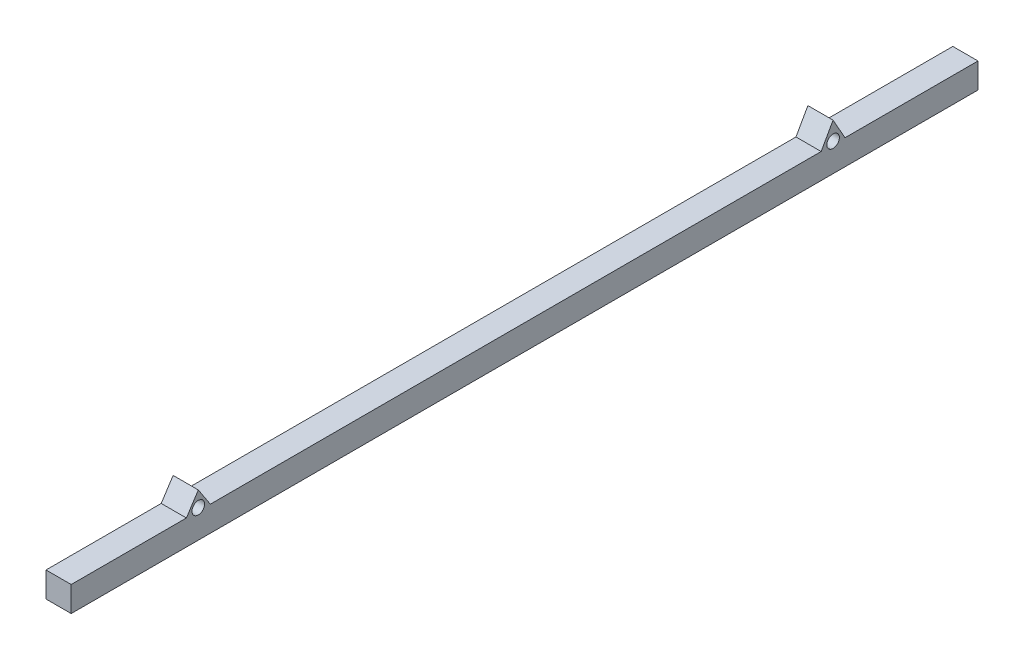
ISO-10303-21;
HEADER;
FILE_DESCRIPTION(('STEP AP214'),'2;1');
FILE_NAME('part.step','',(''),(''),'','','');
FILE_SCHEMA(('AUTOMOTIVE_DESIGN { 1 0 10303 214 1 1 1 1 }'));
ENDSEC;
DATA;
#1=APPLICATION_CONTEXT('core data for automotive mechanical design processes');
#2=APPLICATION_PROTOCOL_DEFINITION('international standard','automotive_design',2000,#1);
#3=PRODUCT_CONTEXT('',#1,'mechanical');
#4=PRODUCT('Part','Part','',(#3));
#5=PRODUCT_RELATED_PRODUCT_CATEGORY('part','',(#4));
#6=PRODUCT_DEFINITION_FORMATION('','',#4);
#7=PRODUCT_DEFINITION_CONTEXT('part definition',#1,'design');
#8=PRODUCT_DEFINITION('design','',#6,#7);
#9=PRODUCT_DEFINITION_SHAPE('','',#8);
#10=(LENGTH_UNIT() NAMED_UNIT(*) SI_UNIT(.MILLI.,.METRE.));
#11=(NAMED_UNIT(*) PLANE_ANGLE_UNIT() SI_UNIT($,.RADIAN.));
#12=(NAMED_UNIT(*) SI_UNIT($,.STERADIAN.) SOLID_ANGLE_UNIT());
#13=UNCERTAINTY_MEASURE_WITH_UNIT(LENGTH_MEASURE(1.E-05),#10,'distance_accuracy_value','');
#14=(GEOMETRIC_REPRESENTATION_CONTEXT(3) GLOBAL_UNCERTAINTY_ASSIGNED_CONTEXT((#13)) GLOBAL_UNIT_ASSIGNED_CONTEXT((#10,
#11,#12)) REPRESENTATION_CONTEXT('',''));
#15=CARTESIAN_POINT('',(0.,0.,0.));
#16=DIRECTION('',(0.,0.,1.));
#17=DIRECTION('',(1.,0.,0.));
#18=AXIS2_PLACEMENT_3D('',#15,#16,#17);
#19=CARTESIAN_POINT('',(-5.,0.,0.));
#20=DIRECTION('',(0.,0.,1.));
#21=DIRECTION('',(1.,0.,0.));
#22=AXIS2_PLACEMENT_3D('',#19,#20,#21);
#23=PLANE('',#22);
#24=DIRECTION('',(0.,-1.,0.));
#25=VECTOR('',#24,1.);
#26=CARTESIAN_POINT('',(0.,0.,0.));
#27=LINE('',#26,#25);
#28=CARTESIAN_POINT('',(0.,5.,0.));
#29=VERTEX_POINT('',#28);
#30=CARTESIAN_POINT('',(0.,0.,0.));
#31=VERTEX_POINT('',#30);
#32=EDGE_CURVE('E146',#29,#31,#27,.T.);
#33=ORIENTED_EDGE('',*,*,#32,.F.);
#34=DIRECTION('',(1.,0.,0.));
#35=VECTOR('',#34,1.);
#36=CARTESIAN_POINT('',(-5.,5.,0.));
#37=LINE('',#36,#35);
#38=CARTESIAN_POINT('',(-5.,5.,0.));
#39=VERTEX_POINT('',#38);
#40=EDGE_CURVE('E11',#39,#29,#37,.T.);
#41=ORIENTED_EDGE('',*,*,#40,.F.);
#42=DIRECTION('',(0.,-1.,0.));
#43=VECTOR('',#42,1.);
#44=CARTESIAN_POINT('',(-5.,0.,0.));
#45=LINE('',#44,#43);
#46=CARTESIAN_POINT('',(-5.,0.,0.));
#47=VERTEX_POINT('',#46);
#48=EDGE_CURVE('E173',#39,#47,#45,.T.);
#49=ORIENTED_EDGE('',*,*,#48,.T.);
#50=DIRECTION('',(1.,0.,0.));
#51=VECTOR('',#50,1.);
#52=CARTESIAN_POINT('',(-5.,0.,0.));
#53=LINE('',#52,#51);
#54=EDGE_CURVE('E40',#47,#31,#53,.T.);
#55=ORIENTED_EDGE('',*,*,#54,.T.);
#56=EDGE_LOOP('',(#33,#41,#49,#55));
#57=FACE_BOUND('',#56,.T.);
#58=ADVANCED_FACE('F37',(#57),#23,.T.);
#59=CARTESIAN_POINT('',(-5.,5.,0.));
#60=DIRECTION('',(0.,1.,0.));
#61=DIRECTION('',(0.,0.,1.));
#62=AXIS2_PLACEMENT_3D('',#59,#60,#61);
#63=PLANE('',#62);
#64=DIRECTION('',(0.,0.,1.));
#65=VECTOR('',#64,1.);
#66=CARTESIAN_POINT('',(0.,5.,0.));
#67=LINE('',#66,#65);
#68=CARTESIAN_POINT('',(0.,5.,-22.8698931809179));
#69=VERTEX_POINT('',#68);
#70=EDGE_CURVE('E171',#69,#29,#67,.T.);
#71=ORIENTED_EDGE('',*,*,#70,.F.);
#72=DIRECTION('',(1.,0.,0.));
#73=VECTOR('',#72,1.);
#74=CARTESIAN_POINT('',(-5.,5.,-22.8698931809179));
#75=LINE('',#74,#73);
#76=CARTESIAN_POINT('',(-5.,5.,-22.8698931809179));
#77=VERTEX_POINT('',#76);
#78=EDGE_CURVE('E46',#77,#69,#75,.T.);
#79=ORIENTED_EDGE('',*,*,#78,.F.);
#80=DIRECTION('',(0.,0.,1.));
#81=VECTOR('',#80,1.);
#82=CARTESIAN_POINT('',(-5.,5.,0.));
#83=LINE('',#82,#81);
#84=EDGE_CURVE('E136',#77,#39,#83,.T.);
#85=ORIENTED_EDGE('',*,*,#84,.T.);
#86=ORIENTED_EDGE('',*,*,#40,.T.);
#87=EDGE_LOOP('',(#71,#79,#85,#86));
#88=FACE_BOUND('',#87,.T.);
#89=ADVANCED_FACE('F189',(#88),#63,.T.);
#90=CARTESIAN_POINT('',(-5.,8.63853703199878,-25.233));
#91=DIRECTION('',(0.,0.544673605340835,0.838648116700334));
#92=DIRECTION('',(0.,-0.838648116700334,0.544673605340835));
#93=AXIS2_PLACEMENT_3D('',#90,#91,#92);
#94=PLANE('',#93);
#95=DIRECTION('',(0.,-0.838648116700334,0.544673605340835));
#96=VECTOR('',#95,1.);
#97=CARTESIAN_POINT('',(0.,8.63853703199878,-25.233));
#98=LINE('',#97,#96);
#99=CARTESIAN_POINT('',(0.,8.63853703199878,-25.233));
#100=VERTEX_POINT('',#99);
#101=EDGE_CURVE('E123',#100,#69,#98,.T.);
#102=ORIENTED_EDGE('',*,*,#101,.F.);
#103=DIRECTION('',(1.,0.,0.));
#104=VECTOR('',#103,1.);
#105=CARTESIAN_POINT('',(-5.,8.63853703199878,-25.233));
#106=LINE('',#105,#104);
#107=CARTESIAN_POINT('',(-5.,8.63853703199878,-25.233));
#108=VERTEX_POINT('',#107);
#109=EDGE_CURVE('E118',#108,#100,#106,.T.);
#110=ORIENTED_EDGE('',*,*,#109,.F.);
#111=DIRECTION('',(0.,-0.838648116700334,0.544673605340835));
#112=VECTOR('',#111,1.);
#113=CARTESIAN_POINT('',(-5.,8.63853703199878,-25.233));
#114=LINE('',#113,#112);
#115=EDGE_CURVE('E121',#108,#77,#114,.T.);
#116=ORIENTED_EDGE('',*,*,#115,.T.);
#117=ORIENTED_EDGE('',*,*,#78,.T.);
#118=EDGE_LOOP('',(#102,#110,#116,#117));
#119=FACE_BOUND('',#118,.T.);
#120=ADVANCED_FACE('F120',(#119),#94,.T.);
#121=CARTESIAN_POINT('',(-5.,8.63853703199878,-25.233));
#122=DIRECTION('',(0.,0.548887878729885,-0.835895984308698));
#123=DIRECTION('',(0.,0.835895984308698,0.548887878729885));
#124=AXIS2_PLACEMENT_3D('',#121,#122,#123);
#125=PLANE('',#124);
#126=DIRECTION('',(0.,0.835895984308698,0.548887878729885));
#127=VECTOR('',#126,1.);
#128=CARTESIAN_POINT('',(0.,8.63853703199878,-25.233));
#129=LINE('',#128,#127);
#130=CARTESIAN_POINT('',(0.,5.,-27.6222313286152));
#131=VERTEX_POINT('',#130);
#132=EDGE_CURVE('E168',#131,#100,#129,.T.);
#133=ORIENTED_EDGE('',*,*,#132,.F.);
#134=DIRECTION('',(1.,0.,0.));
#135=VECTOR('',#134,1.);
#136=CARTESIAN_POINT('',(-5.,5.,-27.6222313286152));
#137=LINE('',#136,#135);
#138=CARTESIAN_POINT('',(-5.,5.,-27.6222313286152));
#139=VERTEX_POINT('',#138);
#140=EDGE_CURVE('E128',#139,#131,#137,.T.);
#141=ORIENTED_EDGE('',*,*,#140,.F.);
#142=DIRECTION('',(0.,0.835895984308698,0.548887878729885));
#143=VECTOR('',#142,1.);
#144=CARTESIAN_POINT('',(-5.,8.63853703199878,-25.233));
#145=LINE('',#144,#143);
#146=EDGE_CURVE('E134',#139,#108,#145,.T.);
#147=ORIENTED_EDGE('',*,*,#146,.T.);
#148=ORIENTED_EDGE('',*,*,#109,.T.);
#149=EDGE_LOOP('',(#133,#141,#147,#148));
#150=FACE_BOUND('',#149,.T.);
#151=ADVANCED_FACE('F138',(#150),#125,.T.);
#152=CARTESIAN_POINT('',(-5.,5.,-27.6222313286152));
#153=DIRECTION('',(0.,1.,0.));
#154=DIRECTION('',(0.,0.,1.));
#155=AXIS2_PLACEMENT_3D('',#152,#153,#154);
#156=PLANE('',#155);
#157=DIRECTION('',(0.,0.,1.));
#158=VECTOR('',#157,1.);
#159=CARTESIAN_POINT('',(0.,5.,-27.6222313286152));
#160=LINE('',#159,#158);
#161=CARTESIAN_POINT('',(0.,5.,-148.86647138583));
#162=VERTEX_POINT('',#161);
#163=EDGE_CURVE('E165',#162,#131,#160,.T.);
#164=ORIENTED_EDGE('',*,*,#163,.F.);
#165=DIRECTION('',(1.,0.,0.));
#166=VECTOR('',#165,1.);
#167=CARTESIAN_POINT('',(-5.,5.,-148.86647138583));
#168=LINE('',#167,#166);
#169=CARTESIAN_POINT('',(-5.,5.,-148.86647138583));
#170=VERTEX_POINT('',#169);
#171=EDGE_CURVE('E177',#170,#162,#168,.T.);
#172=ORIENTED_EDGE('',*,*,#171,.F.);
#173=DIRECTION('',(0.,0.,1.));
#174=VECTOR('',#173,1.);
#175=CARTESIAN_POINT('',(-5.,5.,-27.6222313286152));
#176=LINE('',#175,#174);
#177=EDGE_CURVE('E139',#170,#139,#176,.T.);
#178=ORIENTED_EDGE('',*,*,#177,.T.);
#179=ORIENTED_EDGE('',*,*,#140,.T.);
#180=EDGE_LOOP('',(#164,#172,#178,#179));
#181=FACE_BOUND('',#180,.T.);
#182=ADVANCED_FACE('F202',(#181),#156,.T.);
#183=CARTESIAN_POINT('',(-5.,9.21189857005811,-151.233));
#184=DIRECTION('',(0.,0.489842251703755,0.871811085296462));
#185=DIRECTION('',(0.,-0.871811085296462,0.489842251703755));
#186=AXIS2_PLACEMENT_3D('',#183,#184,#185);
#187=PLANE('',#186);
#188=DIRECTION('',(0.,-0.871811085296462,0.489842251703755));
#189=VECTOR('',#188,1.);
#190=CARTESIAN_POINT('',(0.,9.21189857005811,-151.233));
#191=LINE('',#190,#189);
#192=CARTESIAN_POINT('',(0.,9.21189857005811,-151.233));
#193=VERTEX_POINT('',#192);
#194=EDGE_CURVE('E162',#193,#162,#191,.T.);
#195=ORIENTED_EDGE('',*,*,#194,.F.);
#196=DIRECTION('',(1.,0.,0.));
#197=VECTOR('',#196,1.);
#198=CARTESIAN_POINT('',(-5.,9.21189857005811,-151.233));
#199=LINE('',#198,#197);
#200=CARTESIAN_POINT('',(-5.,9.21189857005811,-151.233));
#201=VERTEX_POINT('',#200);
#202=EDGE_CURVE('E179',#201,#193,#199,.T.);
#203=ORIENTED_EDGE('',*,*,#202,.F.);
#204=DIRECTION('',(0.,-0.871811085296462,0.489842251703755));
#205=VECTOR('',#204,1.);
#206=CARTESIAN_POINT('',(-5.,9.21189857005811,-151.233));
#207=LINE('',#206,#205);
#208=EDGE_CURVE('E141',#201,#170,#207,.T.);
#209=ORIENTED_EDGE('',*,*,#208,.T.);
#210=ORIENTED_EDGE('',*,*,#171,.T.);
#211=EDGE_LOOP('',(#195,#203,#209,#210));
#212=FACE_BOUND('',#211,.T.);
#213=ADVANCED_FACE('F205',(#212),#187,.T.);
#214=CARTESIAN_POINT('',(-5.,9.21189857005811,-151.233));
#215=DIRECTION('',(0.,0.489448415745772,-0.872032251882896));
#216=DIRECTION('',(0.,0.872032251882896,0.489448415745772));
#217=AXIS2_PLACEMENT_3D('',#214,#215,#216);
#218=PLANE('',#217);
#219=DIRECTION('',(0.,0.872032251882896,0.489448415745772));
#220=VECTOR('',#219,1.);
#221=CARTESIAN_POINT('',(0.,9.21189857005811,-151.233));
#222=LINE('',#221,#220);
#223=CARTESIAN_POINT('',(0.,5.,-153.597026190483));
#224=VERTEX_POINT('',#223);
#225=EDGE_CURVE('E159',#224,#193,#222,.T.);
#226=ORIENTED_EDGE('',*,*,#225,.F.);
#227=DIRECTION('',(1.,0.,0.));
#228=VECTOR('',#227,1.);
#229=CARTESIAN_POINT('',(-5.,5.,-153.597026190483));
#230=LINE('',#229,#228);
#231=CARTESIAN_POINT('',(-5.,5.,-153.597026190483));
#232=VERTEX_POINT('',#231);
#233=EDGE_CURVE('E181',#232,#224,#230,.T.);
#234=ORIENTED_EDGE('',*,*,#233,.F.);
#235=DIRECTION('',(0.,0.872032251882896,0.489448415745772));
#236=VECTOR('',#235,1.);
#237=CARTESIAN_POINT('',(-5.,9.21189857005811,-151.233));
#238=LINE('',#237,#236);
#239=EDGE_CURVE('E265',#232,#201,#238,.T.);
#240=ORIENTED_EDGE('',*,*,#239,.T.);
#241=ORIENTED_EDGE('',*,*,#202,.T.);
#242=EDGE_LOOP('',(#226,#234,#240,#241));
#243=FACE_BOUND('',#242,.T.);
#244=ADVANCED_FACE('F209',(#243),#218,.T.);
#245=CARTESIAN_POINT('',(-5.,5.,-153.597026190483));
#246=DIRECTION('',(0.,1.,0.));
#247=DIRECTION('',(0.,0.,1.));
#248=AXIS2_PLACEMENT_3D('',#245,#246,#247);
#249=PLANE('',#248);
#250=DIRECTION('',(0.,0.,1.));
#251=VECTOR('',#250,1.);
#252=CARTESIAN_POINT('',(0.,5.,-153.597026190483));
#253=LINE('',#252,#251);
#254=CARTESIAN_POINT('',(0.,5.,-180.));
#255=VERTEX_POINT('',#254);
#256=EDGE_CURVE('E156',#255,#224,#253,.T.);
#257=ORIENTED_EDGE('',*,*,#256,.F.);
#258=DIRECTION('',(1.,0.,0.));
#259=VECTOR('',#258,1.);
#260=CARTESIAN_POINT('',(-5.,5.,-180.));
#261=LINE('',#260,#259);
#262=CARTESIAN_POINT('',(-5.,5.,-180.));
#263=VERTEX_POINT('',#262);
#264=EDGE_CURVE('E183',#263,#255,#261,.T.);
#265=ORIENTED_EDGE('',*,*,#264,.F.);
#266=DIRECTION('',(0.,0.,1.));
#267=VECTOR('',#266,1.);
#268=CARTESIAN_POINT('',(-5.,5.,-153.597026190483));
#269=LINE('',#268,#267);
#270=EDGE_CURVE('E262',#263,#232,#269,.T.);
#271=ORIENTED_EDGE('',*,*,#270,.T.);
#272=ORIENTED_EDGE('',*,*,#233,.T.);
#273=EDGE_LOOP('',(#257,#265,#271,#272));
#274=FACE_BOUND('',#273,.T.);
#275=ADVANCED_FACE('F213',(#274),#249,.T.);
#276=CARTESIAN_POINT('',(-5.,0.,-180.));
#277=DIRECTION('',(0.,0.,-1.));
#278=DIRECTION('',(-1.,0.,0.));
#279=AXIS2_PLACEMENT_3D('',#276,#277,#278);
#280=PLANE('',#279);
#281=DIRECTION('',(0.,1.,0.));
#282=VECTOR('',#281,1.);
#283=CARTESIAN_POINT('',(0.,0.,-180.));
#284=LINE('',#283,#282);
#285=CARTESIAN_POINT('',(0.,0.,-180.));
#286=VERTEX_POINT('',#285);
#287=EDGE_CURVE('E153',#286,#255,#284,.T.);
#288=ORIENTED_EDGE('',*,*,#287,.F.);
#289=DIRECTION('',(1.,0.,0.));
#290=VECTOR('',#289,1.);
#291=CARTESIAN_POINT('',(-5.,0.,-180.));
#292=LINE('',#291,#290);
#293=CARTESIAN_POINT('',(-5.,0.,-180.));
#294=VERTEX_POINT('',#293);
#295=EDGE_CURVE('E184',#294,#286,#292,.T.);
#296=ORIENTED_EDGE('',*,*,#295,.F.);
#297=DIRECTION('',(0.,1.,0.));
#298=VECTOR('',#297,1.);
#299=CARTESIAN_POINT('',(-5.,0.,-180.));
#300=LINE('',#299,#298);
#301=EDGE_CURVE('E259',#294,#263,#300,.T.);
#302=ORIENTED_EDGE('',*,*,#301,.T.);
#303=ORIENTED_EDGE('',*,*,#264,.T.);
#304=EDGE_LOOP('',(#288,#296,#302,#303));
#305=FACE_BOUND('',#304,.T.);
#306=ADVANCED_FACE('F217',(#305),#280,.T.);
#307=CARTESIAN_POINT('',(-5.,0.,0.));
#308=DIRECTION('',(0.,-1.,0.));
#309=DIRECTION('',(0.,0.,-1.));
#310=AXIS2_PLACEMENT_3D('',#307,#308,#309);
#311=PLANE('',#310);
#312=DIRECTION('',(0.,0.,-1.));
#313=VECTOR('',#312,1.);
#314=CARTESIAN_POINT('',(0.,0.,0.));
#315=LINE('',#314,#313);
#316=EDGE_CURVE('E149',#31,#286,#315,.T.);
#317=ORIENTED_EDGE('',*,*,#316,.F.);
#318=ORIENTED_EDGE('',*,*,#54,.F.);
#319=DIRECTION('',(0.,0.,-1.));
#320=VECTOR('',#319,1.);
#321=CARTESIAN_POINT('',(-5.,0.,0.));
#322=LINE('',#321,#320);
#323=EDGE_CURVE('E257',#47,#294,#322,.T.);
#324=ORIENTED_EDGE('',*,*,#323,.T.);
#325=ORIENTED_EDGE('',*,*,#295,.T.);
#326=EDGE_LOOP('',(#317,#318,#324,#325));
#327=FACE_BOUND('',#326,.T.);
#328=ADVANCED_FACE('F186',(#327),#311,.T.);
#329=CARTESIAN_POINT('',(-5.,0.,0.));
#330=DIRECTION('',(-1.,0.,0.));
#331=DIRECTION('',(0.,0.,1.));
#332=AXIS2_PLACEMENT_3D('',#329,#330,#331);
#333=PLANE('',#332);
#334=CARTESIAN_POINT('',(-5.,5.59375626384249,-151.233));
#335=DIRECTION('',(1.,0.,0.));
#336=DIRECTION('',(0.,0.,-1.));
#337=AXIS2_PLACEMENT_3D('',#334,#335,#336);
#338=CIRCLE('',#337,1.25000000000001);
#339=CARTESIAN_POINT('',(-5.,5.59375626384249,-152.483));
#340=VERTEX_POINT('',#339);
#341=EDGE_CURVE('E244',#340,#340,#338,.T.);
#342=ORIENTED_EDGE('',*,*,#341,.T.);
#343=EDGE_LOOP('',(#342));
#344=FACE_BOUND('',#343,.T.);
#345=CARTESIAN_POINT('',(-5.,5.59375626384249,-25.233));
#346=DIRECTION('',(1.,0.,0.));
#347=DIRECTION('',(0.,0.,-1.));
#348=AXIS2_PLACEMENT_3D('',#345,#346,#347);
#349=CIRCLE('',#348,1.25);
#350=CARTESIAN_POINT('',(-5.,5.59375626384249,-26.483));
#351=VERTEX_POINT('',#350);
#352=EDGE_CURVE('E150',#351,#351,#349,.T.);
#353=ORIENTED_EDGE('',*,*,#352,.T.);
#354=EDGE_LOOP('',(#353));
#355=FACE_BOUND('',#354,.T.);
#356=ORIENTED_EDGE('',*,*,#48,.F.);
#357=ORIENTED_EDGE('',*,*,#84,.F.);
#358=ORIENTED_EDGE('',*,*,#115,.F.);
#359=ORIENTED_EDGE('',*,*,#146,.F.);
#360=ORIENTED_EDGE('',*,*,#177,.F.);
#361=ORIENTED_EDGE('',*,*,#208,.F.);
#362=ORIENTED_EDGE('',*,*,#239,.F.);
#363=ORIENTED_EDGE('',*,*,#270,.F.);
#364=ORIENTED_EDGE('',*,*,#301,.F.);
#365=ORIENTED_EDGE('',*,*,#323,.F.);
#366=EDGE_LOOP('',(#356,#357,#358,#359,#360,#361,#362,#363,#364,#365));
#367=FACE_BOUND('',#366,.T.);
#368=ADVANCED_FACE('F132',(#344,#355,#367),#333,.T.);
#369=CARTESIAN_POINT('',(0.,0.,0.));
#370=DIRECTION('',(-1.,0.,0.));
#371=DIRECTION('',(0.,0.,1.));
#372=AXIS2_PLACEMENT_3D('',#369,#370,#371);
#373=PLANE('',#372);
#374=CARTESIAN_POINT('',(0.,5.59375626384249,-151.233));
#375=DIRECTION('',(1.,0.,0.));
#376=DIRECTION('',(0.,0.,-1.));
#377=AXIS2_PLACEMENT_3D('',#374,#375,#376);
#378=CIRCLE('',#377,1.25000000000001);
#379=CARTESIAN_POINT('',(0.,5.59375626384249,-152.483));
#380=VERTEX_POINT('',#379);
#381=EDGE_CURVE('E247',#380,#380,#378,.T.);
#382=ORIENTED_EDGE('',*,*,#381,.F.);
#383=EDGE_LOOP('',(#382));
#384=FACE_BOUND('',#383,.T.);
#385=CARTESIAN_POINT('',(0.,5.59375626384249,-25.233));
#386=DIRECTION('',(1.,0.,0.));
#387=DIRECTION('',(0.,0.,-1.));
#388=AXIS2_PLACEMENT_3D('',#385,#386,#387);
#389=CIRCLE('',#388,1.25);
#390=CARTESIAN_POINT('',(0.,5.59375626384249,-26.483));
#391=VERTEX_POINT('',#390);
#392=EDGE_CURVE('E249',#391,#391,#389,.T.);
#393=ORIENTED_EDGE('',*,*,#392,.F.);
#394=EDGE_LOOP('',(#393));
#395=FACE_BOUND('',#394,.T.);
#396=ORIENTED_EDGE('',*,*,#32,.T.);
#397=ORIENTED_EDGE('',*,*,#316,.T.);
#398=ORIENTED_EDGE('',*,*,#287,.T.);
#399=ORIENTED_EDGE('',*,*,#256,.T.);
#400=ORIENTED_EDGE('',*,*,#225,.T.);
#401=ORIENTED_EDGE('',*,*,#194,.T.);
#402=ORIENTED_EDGE('',*,*,#163,.T.);
#403=ORIENTED_EDGE('',*,*,#132,.T.);
#404=ORIENTED_EDGE('',*,*,#101,.T.);
#405=ORIENTED_EDGE('',*,*,#70,.T.);
#406=EDGE_LOOP('',(#396,#397,#398,#399,#400,#401,#402,#403,#404,#405));
#407=FACE_BOUND('',#406,.T.);
#408=ADVANCED_FACE('F188',(#384,#395,#407),#373,.F.);
#409=CARTESIAN_POINT('',(-5.,5.59375626384249,-25.233));
#410=DIRECTION('',(1.,0.,0.));
#411=DIRECTION('',(0.,0.,-1.));
#412=AXIS2_PLACEMENT_3D('',#409,#410,#411);
#413=CYLINDRICAL_SURFACE('',#412,1.25);
#414=ORIENTED_EDGE('',*,*,#352,.F.);
#415=EDGE_LOOP('',(#414));
#416=FACE_BOUND('',#415,.T.);
#417=ORIENTED_EDGE('',*,*,#392,.T.);
#418=EDGE_LOOP('',(#417));
#419=FACE_BOUND('',#418,.T.);
#420=ADVANCED_FACE('F229',(#416,#419),#413,.F.);
#421=CARTESIAN_POINT('',(-5.,5.59375626384249,-151.233));
#422=DIRECTION('',(1.,0.,0.));
#423=DIRECTION('',(0.,0.,-1.));
#424=AXIS2_PLACEMENT_3D('',#421,#422,#423);
#425=CYLINDRICAL_SURFACE('',#424,1.25000000000001);
#426=ORIENTED_EDGE('',*,*,#341,.F.);
#427=EDGE_LOOP('',(#426));
#428=FACE_BOUND('',#427,.T.);
#429=ORIENTED_EDGE('',*,*,#381,.T.);
#430=EDGE_LOOP('',(#429));
#431=FACE_BOUND('',#430,.T.);
#432=ADVANCED_FACE('F236',(#428,#431),#425,.F.);
#433=CLOSED_SHELL('',(#58,#89,#120,#151,#182,#213,#244,#275,#306,#328,#368,#408,#420,#432));
#434=MANIFOLD_SOLID_BREP('B2',#433);
#435=ADVANCED_BREP_SHAPE_REPRESENTATION('',(#18,#434),#14);
#436=SHAPE_DEFINITION_REPRESENTATION(#9,#435);
ENDSEC;
END-ISO-10303-21;
